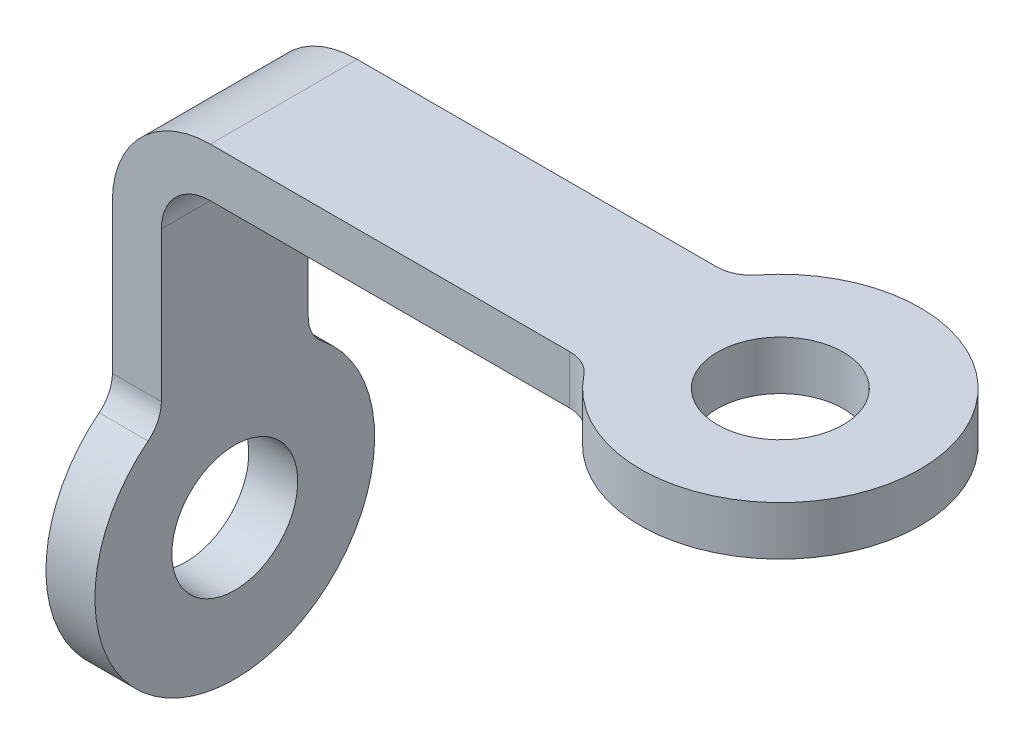
ISO-10303-21;
HEADER;
FILE_DESCRIPTION(('STEP AP214'),'2;1');
FILE_NAME('part.step','',(''),(''),'','','');
FILE_SCHEMA(('AUTOMOTIVE_DESIGN { 1 0 10303 214 1 1 1 1 }'));
ENDSEC;
DATA;
#1=APPLICATION_CONTEXT('core data for automotive mechanical design processes');
#2=APPLICATION_PROTOCOL_DEFINITION('international standard','automotive_design',2000,#1);
#3=PRODUCT_CONTEXT('',#1,'mechanical');
#4=PRODUCT('Part','Part','',(#3));
#5=PRODUCT_RELATED_PRODUCT_CATEGORY('part','',(#4));
#6=PRODUCT_DEFINITION_FORMATION('','',#4);
#7=PRODUCT_DEFINITION_CONTEXT('part definition',#1,'design');
#8=PRODUCT_DEFINITION('design','',#6,#7);
#9=PRODUCT_DEFINITION_SHAPE('','',#8);
#10=(LENGTH_UNIT() NAMED_UNIT(*) SI_UNIT(.MILLI.,.METRE.));
#11=(NAMED_UNIT(*) PLANE_ANGLE_UNIT() SI_UNIT($,.RADIAN.));
#12=(NAMED_UNIT(*) SI_UNIT($,.STERADIAN.) SOLID_ANGLE_UNIT());
#13=UNCERTAINTY_MEASURE_WITH_UNIT(LENGTH_MEASURE(1.E-05),#10,'distance_accuracy_value','');
#14=(GEOMETRIC_REPRESENTATION_CONTEXT(3) GLOBAL_UNCERTAINTY_ASSIGNED_CONTEXT((#13)) GLOBAL_UNIT_ASSIGNED_CONTEXT((#10,
#11,#12)) REPRESENTATION_CONTEXT('',''));
#15=CARTESIAN_POINT('',(0.,0.,0.));
#16=DIRECTION('',(0.,0.,1.));
#17=DIRECTION('',(1.,0.,0.));
#18=AXIS2_PLACEMENT_3D('',#15,#16,#17);
#19=CARTESIAN_POINT('',(-19.615045245933,-7.,-15.5));
#20=DIRECTION('',(0.,1.,0.));
#21=DIRECTION('',(0.,0.,1.));
#22=AXIS2_PLACEMENT_3D('',#19,#20,#21);
#23=PLANE('',#22);
#24=CARTESIAN_POINT('',(0.,-7.,0.));
#25=DIRECTION('',(0.,1.,0.));
#26=DIRECTION('',(0.,0.,1.));
#27=AXIS2_PLACEMENT_3D('',#24,#25,#26);
#28=CIRCLE('',#27,9.);
#29=CARTESIAN_POINT('',(0.,-7.,9.));
#30=VERTEX_POINT('',#29);
#31=EDGE_CURVE('E180',#30,#30,#28,.T.);
#32=ORIENTED_EDGE('',*,*,#31,.T.);
#33=EDGE_LOOP('',(#32));
#34=FACE_BOUND('',#33,.T.);
#35=DIRECTION('',(1.,0.,0.));
#36=VECTOR('',#35,1.);
#37=CARTESIAN_POINT('',(-19.615045245933,-7.,10.5));
#38=LINE('',#37,#36);
#39=CARTESIAN_POINT('',(-71.,-7.,10.5));
#40=VERTEX_POINT('',#39);
#41=CARTESIAN_POINT('',(-19.615045245933,-7.,10.5));
#42=VERTEX_POINT('',#41);
#43=EDGE_CURVE('E187',#40,#42,#38,.T.);
#44=ORIENTED_EDGE('',*,*,#43,.F.);
#45=DIRECTION('',(0.,0.,1.));
#46=VECTOR('',#45,1.);
#47=CARTESIAN_POINT('',(-71.,-7.,-10.5));
#48=LINE('',#47,#46);
#49=CARTESIAN_POINT('',(-71.,-7.,-10.5));
#50=VERTEX_POINT('',#49);
#51=EDGE_CURVE('E58',#40,#50,#48,.F.);
#52=ORIENTED_EDGE('',*,*,#51,.T.);
#53=DIRECTION('',(-1.,0.,0.));
#54=VECTOR('',#53,1.);
#55=CARTESIAN_POINT('',(-19.615045245933,-7.,-10.5));
#56=LINE('',#55,#54);
#57=CARTESIAN_POINT('',(-19.615045245933,-7.,-10.5));
#58=VERTEX_POINT('',#57);
#59=EDGE_CURVE('E186',#58,#50,#56,.T.);
#60=ORIENTED_EDGE('',*,*,#59,.F.);
#61=CARTESIAN_POINT('',(-19.615045245933,-7.,-15.5));
#62=DIRECTION('',(0.,-1.,0.));
#63=DIRECTION('',(0.,0.,1.));
#64=AXIS2_PLACEMENT_3D('',#61,#62,#63);
#65=CIRCLE('',#64,5.);
#66=CARTESIAN_POINT('',(-15.6920361967464,-7.,-12.4));
#67=VERTEX_POINT('',#66);
#68=EDGE_CURVE('E184',#67,#58,#65,.T.);
#69=ORIENTED_EDGE('',*,*,#68,.F.);
#70=CARTESIAN_POINT('',(0.,-7.,0.));
#71=DIRECTION('',(0.,1.,0.));
#72=DIRECTION('',(0.,0.,1.));
#73=AXIS2_PLACEMENT_3D('',#70,#71,#72);
#74=CIRCLE('',#73,20.);
#75=CARTESIAN_POINT('',(-15.6920361967464,-7.,12.4));
#76=VERTEX_POINT('',#75);
#77=EDGE_CURVE('E192',#76,#67,#74,.T.);
#78=ORIENTED_EDGE('',*,*,#77,.F.);
#79=CARTESIAN_POINT('',(-19.615045245933,-7.,15.5));
#80=DIRECTION('',(0.,-1.,0.));
#81=DIRECTION('',(0.,0.,-1.));
#82=AXIS2_PLACEMENT_3D('',#79,#80,#81);
#83=CIRCLE('',#82,5.);
#84=EDGE_CURVE('E191',#42,#76,#83,.T.);
#85=ORIENTED_EDGE('',*,*,#84,.F.);
#86=EDGE_LOOP('',(#44,#52,#60,#69,#78,#85));
#87=FACE_BOUND('',#86,.T.);
#88=ADVANCED_FACE('F39',(#34,#87),#23,.F.);
#89=CARTESIAN_POINT('',(-19.615045245933,-7.,-15.5));
#90=DIRECTION('',(0.,1.,0.));
#91=DIRECTION('',(0.,0.,1.));
#92=AXIS2_PLACEMENT_3D('',#89,#90,#91);
#93=CYLINDRICAL_SURFACE('',#92,5.);
#94=CARTESIAN_POINT('',(-19.615045245933,0.,-15.5));
#95=DIRECTION('',(0.,-1.,0.));
#96=DIRECTION('',(0.,0.,1.));
#97=AXIS2_PLACEMENT_3D('',#94,#95,#96);
#98=CIRCLE('',#97,5.);
#99=CARTESIAN_POINT('',(-15.6920361967464,0.,-12.4));
#100=VERTEX_POINT('',#99);
#101=CARTESIAN_POINT('',(-19.615045245933,0.,-10.5));
#102=VERTEX_POINT('',#101);
#103=EDGE_CURVE('E182',#100,#102,#98,.T.);
#104=ORIENTED_EDGE('',*,*,#103,.F.);
#105=DIRECTION('',(0.,1.,0.));
#106=VECTOR('',#105,1.);
#107=CARTESIAN_POINT('',(-15.6920361967464,-7.,-12.4));
#108=LINE('',#107,#106);
#109=EDGE_CURVE('E211',#67,#100,#108,.T.);
#110=ORIENTED_EDGE('',*,*,#109,.F.);
#111=ORIENTED_EDGE('',*,*,#68,.T.);
#112=DIRECTION('',(0.,1.,0.));
#113=VECTOR('',#112,1.);
#114=CARTESIAN_POINT('',(-19.615045245933,-7.,-10.5));
#115=LINE('',#114,#113);
#116=EDGE_CURVE('E196',#58,#102,#115,.T.);
#117=ORIENTED_EDGE('',*,*,#116,.T.);
#118=EDGE_LOOP('',(#104,#110,#111,#117));
#119=FACE_BOUND('',#118,.T.);
#120=ADVANCED_FACE('F264',(#119),#93,.F.);
#121=CARTESIAN_POINT('',(0.,-7.,0.));
#122=DIRECTION('',(0.,1.,0.));
#123=DIRECTION('',(0.,0.,1.));
#124=AXIS2_PLACEMENT_3D('',#121,#122,#123);
#125=CYLINDRICAL_SURFACE('',#124,20.);
#126=CARTESIAN_POINT('',(0.,0.,0.));
#127=DIRECTION('',(0.,1.,0.));
#128=DIRECTION('',(0.,0.,1.));
#129=AXIS2_PLACEMENT_3D('',#126,#127,#128);
#130=CIRCLE('',#129,20.);
#131=CARTESIAN_POINT('',(-15.6920361967464,0.,12.4));
#132=VERTEX_POINT('',#131);
#133=EDGE_CURVE('E190',#132,#100,#130,.T.);
#134=ORIENTED_EDGE('',*,*,#133,.F.);
#135=DIRECTION('',(0.,1.,0.));
#136=VECTOR('',#135,1.);
#137=CARTESIAN_POINT('',(-15.6920361967464,-7.,12.4));
#138=LINE('',#137,#136);
#139=EDGE_CURVE('E212',#76,#132,#138,.T.);
#140=ORIENTED_EDGE('',*,*,#139,.F.);
#141=ORIENTED_EDGE('',*,*,#77,.T.);
#142=ORIENTED_EDGE('',*,*,#109,.T.);
#143=EDGE_LOOP('',(#134,#140,#141,#142));
#144=FACE_BOUND('',#143,.T.);
#145=ADVANCED_FACE('F275',(#144),#125,.T.);
#146=CARTESIAN_POINT('',(-19.615045245933,-7.,15.5));
#147=DIRECTION('',(0.,1.,0.));
#148=DIRECTION('',(0.,0.,1.));
#149=AXIS2_PLACEMENT_3D('',#146,#147,#148);
#150=CYLINDRICAL_SURFACE('',#149,5.);
#151=CARTESIAN_POINT('',(-19.615045245933,0.,15.5));
#152=DIRECTION('',(0.,-1.,0.));
#153=DIRECTION('',(0.,0.,-1.));
#154=AXIS2_PLACEMENT_3D('',#151,#152,#153);
#155=CIRCLE('',#154,5.);
#156=CARTESIAN_POINT('',(-19.615045245933,0.,10.5));
#157=VERTEX_POINT('',#156);
#158=EDGE_CURVE('E206',#157,#132,#155,.T.);
#159=ORIENTED_EDGE('',*,*,#158,.F.);
#160=DIRECTION('',(0.,1.,0.));
#161=VECTOR('',#160,1.);
#162=CARTESIAN_POINT('',(-19.615045245933,-7.,10.5));
#163=LINE('',#162,#161);
#164=EDGE_CURVE('E216',#42,#157,#163,.T.);
#165=ORIENTED_EDGE('',*,*,#164,.F.);
#166=ORIENTED_EDGE('',*,*,#84,.T.);
#167=ORIENTED_EDGE('',*,*,#139,.T.);
#168=EDGE_LOOP('',(#159,#165,#166,#167));
#169=FACE_BOUND('',#168,.T.);
#170=ADVANCED_FACE('F285',(#169),#150,.F.);
#171=CARTESIAN_POINT('',(-19.615045245933,-7.,10.5));
#172=DIRECTION('',(0.,0.,1.));
#173=DIRECTION('',(1.,0.,0.));
#174=AXIS2_PLACEMENT_3D('',#171,#172,#173);
#175=PLANE('',#174);
#176=DIRECTION('',(1.,0.,0.));
#177=VECTOR('',#176,1.);
#178=CARTESIAN_POINT('',(-19.615045245933,0.,10.5));
#179=LINE('',#178,#177);
#180=CARTESIAN_POINT('',(-71.,0.,10.5));
#181=VERTEX_POINT('',#180);
#182=EDGE_CURVE('E204',#181,#157,#179,.T.);
#183=ORIENTED_EDGE('',*,*,#182,.F.);
#184=CARTESIAN_POINT('',(-71.,-14.,10.5));
#185=DIRECTION('',(0.,0.,1.));
#186=DIRECTION('',(1.,0.,0.));
#187=AXIS2_PLACEMENT_3D('',#184,#185,#186);
#188=CIRCLE('',#187,14.);
#189=CARTESIAN_POINT('',(-85.,-14.,10.5));
#190=VERTEX_POINT('',#189);
#191=EDGE_CURVE('E229',#181,#190,#188,.T.);
#192=ORIENTED_EDGE('',*,*,#191,.T.);
#193=DIRECTION('',(0.,1.,0.));
#194=VECTOR('',#193,1.);
#195=CARTESIAN_POINT('',(-85.,-7.,10.5));
#196=LINE('',#195,#194);
#197=CARTESIAN_POINT('',(-85.,-35.384954754067,10.5));
#198=VERTEX_POINT('',#197);
#199=EDGE_CURVE('E134',#198,#190,#196,.T.);
#200=ORIENTED_EDGE('',*,*,#199,.F.);
#201=DIRECTION('',(-1.,0.,0.));
#202=VECTOR('',#201,1.);
#203=CARTESIAN_POINT('',(-78.,-35.384954754067,10.5));
#204=LINE('',#203,#202);
#205=CARTESIAN_POINT('',(-78.,-35.384954754067,10.5));
#206=VERTEX_POINT('',#205);
#207=EDGE_CURVE('E122',#206,#198,#204,.T.);
#208=ORIENTED_EDGE('',*,*,#207,.F.);
#209=DIRECTION('',(0.,1.,0.));
#210=VECTOR('',#209,1.);
#211=CARTESIAN_POINT('',(-78.,-35.384954754067,10.5));
#212=LINE('',#211,#210);
#213=CARTESIAN_POINT('',(-78.,-14.,10.5));
#214=VERTEX_POINT('',#213);
#215=EDGE_CURVE('E129',#206,#214,#212,.T.);
#216=ORIENTED_EDGE('',*,*,#215,.T.);
#217=CARTESIAN_POINT('',(-71.,-14.,10.5));
#218=DIRECTION('',(0.,0.,1.));
#219=DIRECTION('',(1.,0.,0.));
#220=AXIS2_PLACEMENT_3D('',#217,#218,#219);
#221=CIRCLE('',#220,7.);
#222=EDGE_CURVE('E50',#214,#40,#221,.F.);
#223=ORIENTED_EDGE('',*,*,#222,.T.);
#224=ORIENTED_EDGE('',*,*,#43,.T.);
#225=ORIENTED_EDGE('',*,*,#164,.T.);
#226=EDGE_LOOP('',(#183,#192,#200,#208,#216,#223,#224,#225));
#227=FACE_BOUND('',#226,.T.);
#228=ADVANCED_FACE('F126',(#227),#175,.T.);
#229=CARTESIAN_POINT('',(-85.,-7.,-10.5));
#230=DIRECTION('',(-1.,0.,0.));
#231=DIRECTION('',(0.,0.,1.));
#232=AXIS2_PLACEMENT_3D('',#229,#230,#231);
#233=PLANE('',#232);
#234=ORIENTED_EDGE('',*,*,#199,.T.);
#235=DIRECTION('',(0.,0.,1.));
#236=VECTOR('',#235,1.);
#237=CARTESIAN_POINT('',(-85.,-14.,-10.5));
#238=LINE('',#237,#236);
#239=CARTESIAN_POINT('',(-85.,-14.,-10.5));
#240=VERTEX_POINT('',#239);
#241=EDGE_CURVE('E230',#190,#240,#238,.F.);
#242=ORIENTED_EDGE('',*,*,#241,.T.);
#243=DIRECTION('',(0.,1.,0.));
#244=VECTOR('',#243,1.);
#245=CARTESIAN_POINT('',(-85.,-7.,-10.5));
#246=LINE('',#245,#244);
#247=CARTESIAN_POINT('',(-85.,-35.384954754067,-10.5));
#248=VERTEX_POINT('',#247);
#249=EDGE_CURVE('E219',#248,#240,#246,.T.);
#250=ORIENTED_EDGE('',*,*,#249,.F.);
#251=CARTESIAN_POINT('',(-85.,-35.384954754067,-15.5));
#252=DIRECTION('',(1.,0.,0.));
#253=DIRECTION('',(0.,0.,-1.));
#254=AXIS2_PLACEMENT_3D('',#251,#252,#253);
#255=CIRCLE('',#254,5.);
#256=CARTESIAN_POINT('',(-85.,-39.3079638032536,-12.4));
#257=VERTEX_POINT('',#256);
#258=EDGE_CURVE('E156',#248,#257,#255,.T.);
#259=ORIENTED_EDGE('',*,*,#258,.T.);
#260=CARTESIAN_POINT('',(-85.,-55.,0.));
#261=DIRECTION('',(-1.,0.,0.));
#262=DIRECTION('',(0.,0.,1.));
#263=AXIS2_PLACEMENT_3D('',#260,#261,#262);
#264=CIRCLE('',#263,20.);
#265=CARTESIAN_POINT('',(-85.,-39.3079638032536,12.4));
#266=VERTEX_POINT('',#265);
#267=EDGE_CURVE('E153',#257,#266,#264,.T.);
#268=ORIENTED_EDGE('',*,*,#267,.T.);
#269=CARTESIAN_POINT('',(-85.,-35.384954754067,15.5));
#270=DIRECTION('',(1.,0.,0.));
#271=DIRECTION('',(0.,0.,1.));
#272=AXIS2_PLACEMENT_3D('',#269,#270,#271);
#273=CIRCLE('',#272,5.00000000000001);
#274=EDGE_CURVE('E170',#266,#198,#273,.T.);
#275=ORIENTED_EDGE('',*,*,#274,.T.);
#276=EDGE_LOOP('',(#234,#242,#250,#259,#268,#275));
#277=FACE_BOUND('',#276,.T.);
#278=CARTESIAN_POINT('',(-85.,-55.,0.));
#279=DIRECTION('',(-1.,0.,0.));
#280=DIRECTION('',(0.,0.,1.));
#281=AXIS2_PLACEMENT_3D('',#278,#279,#280);
#282=CIRCLE('',#281,9.00000000000001);
#283=CARTESIAN_POINT('',(-85.,-55.,9.00000000000002));
#284=VERTEX_POINT('',#283);
#285=EDGE_CURVE('E157',#284,#284,#282,.T.);
#286=ORIENTED_EDGE('',*,*,#285,.F.);
#287=EDGE_LOOP('',(#286));
#288=FACE_BOUND('',#287,.T.);
#289=ADVANCED_FACE('F249',(#277,#288),#233,.T.);
#290=CARTESIAN_POINT('',(-19.615045245933,-7.,-10.5));
#291=DIRECTION('',(0.,0.,-1.));
#292=DIRECTION('',(-1.,0.,0.));
#293=AXIS2_PLACEMENT_3D('',#290,#291,#292);
#294=PLANE('',#293);
#295=ORIENTED_EDGE('',*,*,#249,.T.);
#296=CARTESIAN_POINT('',(-71.,-14.,-10.5));
#297=DIRECTION('',(0.,0.,-1.));
#298=DIRECTION('',(-1.,0.,0.));
#299=AXIS2_PLACEMENT_3D('',#296,#297,#298);
#300=CIRCLE('',#299,14.);
#301=CARTESIAN_POINT('',(-71.,0.,-10.5));
#302=VERTEX_POINT('',#301);
#303=EDGE_CURVE('E227',#240,#302,#300,.T.);
#304=ORIENTED_EDGE('',*,*,#303,.T.);
#305=DIRECTION('',(-1.,0.,0.));
#306=VECTOR('',#305,1.);
#307=CARTESIAN_POINT('',(-19.615045245933,0.,-10.5));
#308=LINE('',#307,#306);
#309=EDGE_CURVE('E203',#102,#302,#308,.T.);
#310=ORIENTED_EDGE('',*,*,#309,.F.);
#311=ORIENTED_EDGE('',*,*,#116,.F.);
#312=ORIENTED_EDGE('',*,*,#59,.T.);
#313=CARTESIAN_POINT('',(-71.,-14.,-10.5));
#314=DIRECTION('',(0.,0.,-1.));
#315=DIRECTION('',(-1.,0.,0.));
#316=AXIS2_PLACEMENT_3D('',#313,#314,#315);
#317=CIRCLE('',#316,7.);
#318=CARTESIAN_POINT('',(-78.,-14.,-10.5));
#319=VERTEX_POINT('',#318);
#320=EDGE_CURVE('E11',#50,#319,#317,.F.);
#321=ORIENTED_EDGE('',*,*,#320,.T.);
#322=DIRECTION('',(0.,-1.,0.));
#323=VECTOR('',#322,1.);
#324=CARTESIAN_POINT('',(-78.,-35.384954754067,-10.5));
#325=LINE('',#324,#323);
#326=CARTESIAN_POINT('',(-78.,-35.384954754067,-10.5));
#327=VERTEX_POINT('',#326);
#328=EDGE_CURVE('E149',#319,#327,#325,.T.);
#329=ORIENTED_EDGE('',*,*,#328,.T.);
#330=DIRECTION('',(-1.,0.,0.));
#331=VECTOR('',#330,1.);
#332=CARTESIAN_POINT('',(-78.,-35.384954754067,-10.5));
#333=LINE('',#332,#331);
#334=EDGE_CURVE('E139',#327,#248,#333,.T.);
#335=ORIENTED_EDGE('',*,*,#334,.T.);
#336=EDGE_LOOP('',(#295,#304,#310,#311,#312,#321,#329,#335));
#337=FACE_BOUND('',#336,.T.);
#338=ADVANCED_FACE('F237',(#337),#294,.T.);
#339=CARTESIAN_POINT('',(-19.615045245933,0.,-15.5));
#340=DIRECTION('',(0.,1.,0.));
#341=DIRECTION('',(0.,0.,1.));
#342=AXIS2_PLACEMENT_3D('',#339,#340,#341);
#343=PLANE('',#342);
#344=ORIENTED_EDGE('',*,*,#309,.T.);
#345=DIRECTION('',(0.,0.,1.));
#346=VECTOR('',#345,1.);
#347=CARTESIAN_POINT('',(-71.,0.,-15.5));
#348=LINE('',#347,#346);
#349=EDGE_CURVE('E213',#302,#181,#348,.T.);
#350=ORIENTED_EDGE('',*,*,#349,.T.);
#351=ORIENTED_EDGE('',*,*,#182,.T.);
#352=ORIENTED_EDGE('',*,*,#158,.T.);
#353=ORIENTED_EDGE('',*,*,#133,.T.);
#354=ORIENTED_EDGE('',*,*,#103,.T.);
#355=EDGE_LOOP('',(#344,#350,#351,#352,#353,#354));
#356=FACE_BOUND('',#355,.T.);
#357=CARTESIAN_POINT('',(0.,0.,0.));
#358=DIRECTION('',(0.,1.,0.));
#359=DIRECTION('',(0.,0.,1.));
#360=AXIS2_PLACEMENT_3D('',#357,#358,#359);
#361=CIRCLE('',#360,9.);
#362=CARTESIAN_POINT('',(0.,0.,9.));
#363=VERTEX_POINT('',#362);
#364=EDGE_CURVE('E175',#363,#363,#361,.T.);
#365=ORIENTED_EDGE('',*,*,#364,.F.);
#366=EDGE_LOOP('',(#365));
#367=FACE_BOUND('',#366,.T.);
#368=ADVANCED_FACE('F244',(#356,#367),#343,.T.);
#369=CARTESIAN_POINT('',(0.,-7.,0.));
#370=DIRECTION('',(0.,1.,0.));
#371=DIRECTION('',(0.,0.,1.));
#372=AXIS2_PLACEMENT_3D('',#369,#370,#371);
#373=CYLINDRICAL_SURFACE('',#372,9.);
#374=ORIENTED_EDGE('',*,*,#31,.F.);
#375=EDGE_LOOP('',(#374));
#376=FACE_BOUND('',#375,.T.);
#377=ORIENTED_EDGE('',*,*,#364,.T.);
#378=EDGE_LOOP('',(#377));
#379=FACE_BOUND('',#378,.T.);
#380=ADVANCED_FACE('F280',(#376,#379),#373,.F.);
#381=CARTESIAN_POINT('',(-78.,-35.384954754067,15.5));
#382=DIRECTION('',(-1.,0.,0.));
#383=DIRECTION('',(0.,0.,1.));
#384=AXIS2_PLACEMENT_3D('',#381,#382,#383);
#385=PLANE('',#384);
#386=CARTESIAN_POINT('',(-78.,-55.,0.));
#387=DIRECTION('',(-1.,0.,0.));
#388=DIRECTION('',(0.,0.,1.));
#389=AXIS2_PLACEMENT_3D('',#386,#387,#388);
#390=CIRCLE('',#389,9.00000000000001);
#391=CARTESIAN_POINT('',(-78.,-55.,9.00000000000002));
#392=VERTEX_POINT('',#391);
#393=EDGE_CURVE('E166',#392,#392,#390,.T.);
#394=ORIENTED_EDGE('',*,*,#393,.T.);
#395=EDGE_LOOP('',(#394));
#396=FACE_BOUND('',#395,.T.);
#397=ORIENTED_EDGE('',*,*,#328,.F.);
#398=DIRECTION('',(0.,0.,1.));
#399=VECTOR('',#398,1.);
#400=CARTESIAN_POINT('',(-78.,-14.,10.5));
#401=LINE('',#400,#399);
#402=EDGE_CURVE('E146',#319,#214,#401,.T.);
#403=ORIENTED_EDGE('',*,*,#402,.T.);
#404=ORIENTED_EDGE('',*,*,#215,.F.);
#405=CARTESIAN_POINT('',(-78.,-35.384954754067,15.5));
#406=DIRECTION('',(1.,0.,0.));
#407=DIRECTION('',(0.,0.,1.));
#408=AXIS2_PLACEMENT_3D('',#405,#406,#407);
#409=CIRCLE('',#408,5.00000000000001);
#410=CARTESIAN_POINT('',(-78.,-39.3079638032536,12.4));
#411=VERTEX_POINT('',#410);
#412=EDGE_CURVE('E144',#411,#206,#409,.T.);
#413=ORIENTED_EDGE('',*,*,#412,.F.);
#414=CARTESIAN_POINT('',(-78.,-55.,0.));
#415=DIRECTION('',(-1.,0.,0.));
#416=DIRECTION('',(0.,0.,1.));
#417=AXIS2_PLACEMENT_3D('',#414,#415,#416);
#418=CIRCLE('',#417,20.);
#419=CARTESIAN_POINT('',(-78.,-39.3079638032536,-12.4));
#420=VERTEX_POINT('',#419);
#421=EDGE_CURVE('E136',#420,#411,#418,.T.);
#422=ORIENTED_EDGE('',*,*,#421,.F.);
#423=CARTESIAN_POINT('',(-78.,-35.384954754067,-15.5));
#424=DIRECTION('',(1.,0.,0.));
#425=DIRECTION('',(0.,0.,-1.));
#426=AXIS2_PLACEMENT_3D('',#423,#424,#425);
#427=CIRCLE('',#426,5.);
#428=EDGE_CURVE('E162',#327,#420,#427,.T.);
#429=ORIENTED_EDGE('',*,*,#428,.F.);
#430=EDGE_LOOP('',(#397,#403,#404,#413,#422,#429));
#431=FACE_BOUND('',#430,.T.);
#432=ADVANCED_FACE('F141',(#396,#431),#385,.F.);
#433=CARTESIAN_POINT('',(-78.,-35.384954754067,15.5));
#434=DIRECTION('',(-1.,0.,0.));
#435=DIRECTION('',(0.,0.,1.));
#436=AXIS2_PLACEMENT_3D('',#433,#434,#435);
#437=CYLINDRICAL_SURFACE('',#436,5.00000000000001);
#438=ORIENTED_EDGE('',*,*,#274,.F.);
#439=DIRECTION('',(-1.,0.,0.));
#440=VECTOR('',#439,1.);
#441=CARTESIAN_POINT('',(-78.,-39.3079638032536,12.4));
#442=LINE('',#441,#440);
#443=EDGE_CURVE('E155',#411,#266,#442,.T.);
#444=ORIENTED_EDGE('',*,*,#443,.F.);
#445=ORIENTED_EDGE('',*,*,#412,.T.);
#446=ORIENTED_EDGE('',*,*,#207,.T.);
#447=EDGE_LOOP('',(#438,#444,#445,#446));
#448=FACE_BOUND('',#447,.T.);
#449=ADVANCED_FACE('F151',(#448),#437,.F.);
#450=CARTESIAN_POINT('',(-78.,-55.,0.));
#451=DIRECTION('',(-1.,0.,0.));
#452=DIRECTION('',(0.,0.,1.));
#453=AXIS2_PLACEMENT_3D('',#450,#451,#452);
#454=CYLINDRICAL_SURFACE('',#453,20.);
#455=ORIENTED_EDGE('',*,*,#267,.F.);
#456=DIRECTION('',(-1.,0.,0.));
#457=VECTOR('',#456,1.);
#458=CARTESIAN_POINT('',(-78.,-39.3079638032536,-12.4));
#459=LINE('',#458,#457);
#460=EDGE_CURVE('E173',#420,#257,#459,.T.);
#461=ORIENTED_EDGE('',*,*,#460,.F.);
#462=ORIENTED_EDGE('',*,*,#421,.T.);
#463=ORIENTED_EDGE('',*,*,#443,.T.);
#464=EDGE_LOOP('',(#455,#461,#462,#463));
#465=FACE_BOUND('',#464,.T.);
#466=ADVANCED_FACE('F253',(#465),#454,.T.);
#467=CARTESIAN_POINT('',(-78.,-35.384954754067,-15.5));
#468=DIRECTION('',(-1.,0.,0.));
#469=DIRECTION('',(0.,0.,1.));
#470=AXIS2_PLACEMENT_3D('',#467,#468,#469);
#471=CYLINDRICAL_SURFACE('',#470,5.);
#472=ORIENTED_EDGE('',*,*,#258,.F.);
#473=ORIENTED_EDGE('',*,*,#334,.F.);
#474=ORIENTED_EDGE('',*,*,#428,.T.);
#475=ORIENTED_EDGE('',*,*,#460,.T.);
#476=EDGE_LOOP('',(#472,#473,#474,#475));
#477=FACE_BOUND('',#476,.T.);
#478=ADVANCED_FACE('F254',(#477),#471,.F.);
#479=CARTESIAN_POINT('',(-78.,-55.,0.));
#480=DIRECTION('',(-1.,0.,0.));
#481=DIRECTION('',(0.,0.,1.));
#482=AXIS2_PLACEMENT_3D('',#479,#480,#481);
#483=CYLINDRICAL_SURFACE('',#482,9.00000000000001);
#484=ORIENTED_EDGE('',*,*,#393,.F.);
#485=EDGE_LOOP('',(#484));
#486=FACE_BOUND('',#485,.T.);
#487=ORIENTED_EDGE('',*,*,#285,.T.);
#488=EDGE_LOOP('',(#487));
#489=FACE_BOUND('',#488,.T.);
#490=ADVANCED_FACE('F263',(#486,#489),#483,.F.);
#491=CARTESIAN_POINT('',(-71.,-14.,-15.5));
#492=DIRECTION('',(0.,0.,1.));
#493=DIRECTION('',(1.,0.,0.));
#494=AXIS2_PLACEMENT_3D('',#491,#492,#493);
#495=CYLINDRICAL_SURFACE('',#494,14.);
#496=ORIENTED_EDGE('',*,*,#303,.F.);
#497=ORIENTED_EDGE('',*,*,#241,.F.);
#498=ORIENTED_EDGE('',*,*,#191,.F.);
#499=ORIENTED_EDGE('',*,*,#349,.F.);
#500=EDGE_LOOP('',(#496,#497,#498,#499));
#501=FACE_BOUND('',#500,.T.);
#502=ADVANCED_FACE('F243',(#501),#495,.T.);
#503=CARTESIAN_POINT('',(-71.,-14.,15.5));
#504=DIRECTION('',(0.,0.,-1.));
#505=DIRECTION('',(-1.,0.,0.));
#506=AXIS2_PLACEMENT_3D('',#503,#504,#505);
#507=CYLINDRICAL_SURFACE('',#506,7.);
#508=ORIENTED_EDGE('',*,*,#320,.F.);
#509=ORIENTED_EDGE('',*,*,#51,.F.);
#510=ORIENTED_EDGE('',*,*,#222,.F.);
#511=ORIENTED_EDGE('',*,*,#402,.F.);
#512=EDGE_LOOP('',(#508,#509,#510,#511));
#513=FACE_BOUND('',#512,.T.);
#514=ADVANCED_FACE('F41',(#513),#507,.F.);
#515=CLOSED_SHELL('',(#88,#120,#145,#170,#228,#289,#338,#368,#380,#432,#449,#466,#478,#490,#502,#514));
#516=MANIFOLD_SOLID_BREP('B2',#515);
#517=ADVANCED_BREP_SHAPE_REPRESENTATION('',(#18,#516),#14);
#518=SHAPE_DEFINITION_REPRESENTATION(#9,#517);
ENDSEC;
END-ISO-10303-21;
